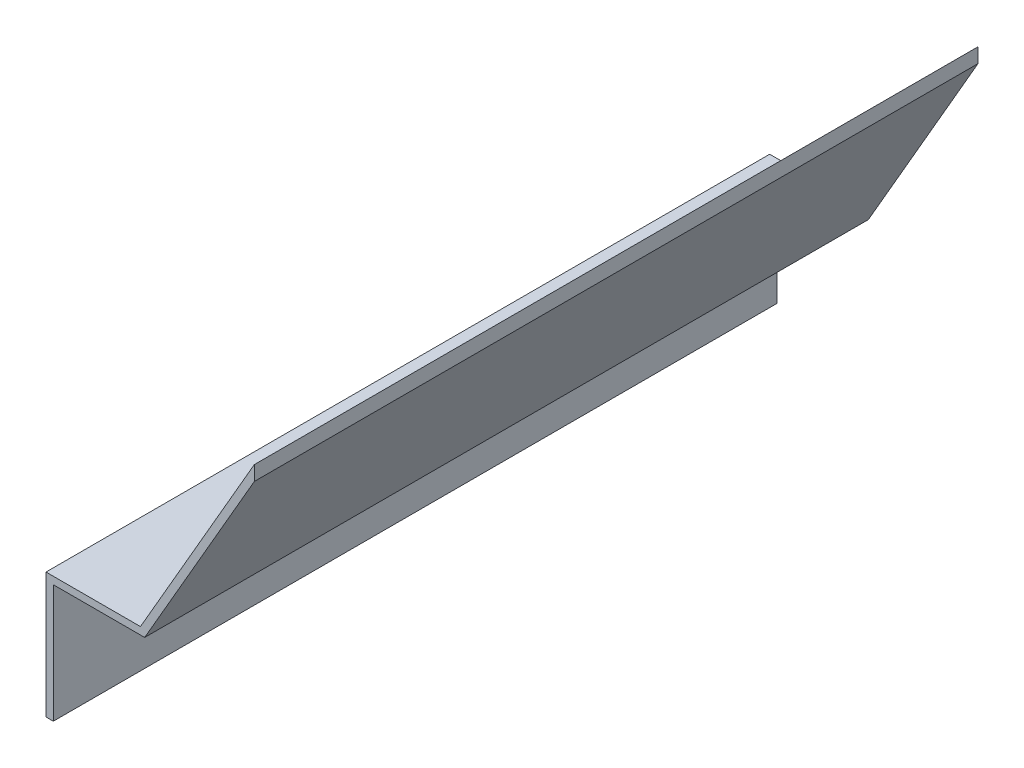
ISO-10303-21;
HEADER;
FILE_DESCRIPTION(('STEP AP214'),'2;1');
FILE_NAME('part.step','',(''),(''),'','','');
FILE_SCHEMA(('AUTOMOTIVE_DESIGN { 1 0 10303 214 1 1 1 1 }'));
ENDSEC;
DATA;
#1=APPLICATION_CONTEXT('core data for automotive mechanical design processes');
#2=APPLICATION_PROTOCOL_DEFINITION('international standard','automotive_design',2000,#1);
#3=PRODUCT_CONTEXT('',#1,'mechanical');
#4=PRODUCT('Part','Part','',(#3));
#5=PRODUCT_RELATED_PRODUCT_CATEGORY('part','',(#4));
#6=PRODUCT_DEFINITION_FORMATION('','',#4);
#7=PRODUCT_DEFINITION_CONTEXT('part definition',#1,'design');
#8=PRODUCT_DEFINITION('design','',#6,#7);
#9=PRODUCT_DEFINITION_SHAPE('','',#8);
#10=(LENGTH_UNIT() NAMED_UNIT(*) SI_UNIT(.MILLI.,.METRE.));
#11=(NAMED_UNIT(*) PLANE_ANGLE_UNIT() SI_UNIT($,.RADIAN.));
#12=(NAMED_UNIT(*) SI_UNIT($,.STERADIAN.) SOLID_ANGLE_UNIT());
#13=UNCERTAINTY_MEASURE_WITH_UNIT(LENGTH_MEASURE(1.E-05),#10,'distance_accuracy_value','');
#14=(GEOMETRIC_REPRESENTATION_CONTEXT(3) GLOBAL_UNCERTAINTY_ASSIGNED_CONTEXT((#13)) GLOBAL_UNIT_ASSIGNED_CONTEXT((#10,
#11,#12)) REPRESENTATION_CONTEXT('',''));
#15=CARTESIAN_POINT('',(0.,0.,0.));
#16=DIRECTION('',(0.,0.,1.));
#17=DIRECTION('',(1.,0.,0.));
#18=AXIS2_PLACEMENT_3D('',#15,#16,#17);
#19=CARTESIAN_POINT('',(-108.888143665837,84.1038517563225,198.));
#20=DIRECTION('',(0.,1.,0.));
#21=DIRECTION('',(0.,0.,1.));
#22=AXIS2_PLACEMENT_3D('',#19,#20,#21);
#23=PLANE('',#22);
#24=DIRECTION('',(1.,0.,0.));
#25=VECTOR('',#24,1.);
#26=CARTESIAN_POINT('',(-108.888143665837,84.1038517563225,0.));
#27=LINE('',#26,#25);
#28=CARTESIAN_POINT('',(-108.888143665837,84.1038517563225,0.));
#29=VERTEX_POINT('',#28);
#30=CARTESIAN_POINT('',(-106.888143665837,84.1038517563225,0.));
#31=VERTEX_POINT('',#30);
#32=EDGE_CURVE('E138',#29,#31,#27,.T.);
#33=ORIENTED_EDGE('',*,*,#32,.T.);
#34=DIRECTION('',(0.,0.,-1.));
#35=VECTOR('',#34,1.);
#36=CARTESIAN_POINT('',(-106.888143665837,84.1038517563225,198.));
#37=LINE('',#36,#35);
#38=CARTESIAN_POINT('',(-106.888143665837,84.1038517563225,198.));
#39=VERTEX_POINT('',#38);
#40=EDGE_CURVE('E11',#39,#31,#37,.T.);
#41=ORIENTED_EDGE('',*,*,#40,.F.);
#42=DIRECTION('',(1.,0.,0.));
#43=VECTOR('',#42,1.);
#44=CARTESIAN_POINT('',(-108.888143665837,84.1038517563225,198.));
#45=LINE('',#44,#43);
#46=CARTESIAN_POINT('',(-108.888143665837,84.1038517563225,198.));
#47=VERTEX_POINT('',#46);
#48=EDGE_CURVE('E153',#47,#39,#45,.T.);
#49=ORIENTED_EDGE('',*,*,#48,.F.);
#50=DIRECTION('',(0.,0.,-1.));
#51=VECTOR('',#50,1.);
#52=CARTESIAN_POINT('',(-108.888143665837,84.1038517563225,198.));
#53=LINE('',#52,#51);
#54=EDGE_CURVE('E134',#47,#29,#53,.T.);
#55=ORIENTED_EDGE('',*,*,#54,.T.);
#56=EDGE_LOOP('',(#33,#41,#49,#55));
#57=FACE_BOUND('',#56,.T.);
#58=ADVANCED_FACE('F43',(#57),#23,.F.);
#59=CARTESIAN_POINT('',(-106.888143665837,84.1038517563225,198.));
#60=DIRECTION('',(-1.,0.,0.));
#61=DIRECTION('',(0.,-1.,0.));
#62=AXIS2_PLACEMENT_3D('',#59,#60,#61);
#63=PLANE('',#62);
#64=DIRECTION('',(0.,1.,0.));
#65=VECTOR('',#64,1.);
#66=CARTESIAN_POINT('',(-106.888143665837,84.1038517563225,0.));
#67=LINE('',#66,#65);
#68=CARTESIAN_POINT('',(-106.888143665837,116.45919081565,0.));
#69=VERTEX_POINT('',#68);
#70=EDGE_CURVE('E141',#31,#69,#67,.T.);
#71=ORIENTED_EDGE('',*,*,#70,.T.);
#72=DIRECTION('',(0.,0.,-1.));
#73=VECTOR('',#72,1.);
#74=CARTESIAN_POINT('',(-106.888143665837,116.45919081565,198.));
#75=LINE('',#74,#73);
#76=CARTESIAN_POINT('',(-106.888143665837,116.45919081565,198.));
#77=VERTEX_POINT('',#76);
#78=EDGE_CURVE('E51',#77,#69,#75,.T.);
#79=ORIENTED_EDGE('',*,*,#78,.F.);
#80=DIRECTION('',(0.,1.,0.));
#81=VECTOR('',#80,1.);
#82=CARTESIAN_POINT('',(-106.888143665837,84.1038517563225,198.));
#83=LINE('',#82,#81);
#84=EDGE_CURVE('E102',#39,#77,#83,.T.);
#85=ORIENTED_EDGE('',*,*,#84,.F.);
#86=ORIENTED_EDGE('',*,*,#40,.T.);
#87=EDGE_LOOP('',(#71,#79,#85,#86));
#88=FACE_BOUND('',#87,.T.);
#89=ADVANCED_FACE('F188',(#88),#63,.F.);
#90=CARTESIAN_POINT('',(-106.888143665837,116.45919081565,198.));
#91=DIRECTION('',(0.,1.,0.));
#92=DIRECTION('',(0.,0.,1.));
#93=AXIS2_PLACEMENT_3D('',#90,#91,#92);
#94=PLANE('',#93);
#95=DIRECTION('',(1.,0.,0.));
#96=VECTOR('',#95,1.);
#97=CARTESIAN_POINT('',(-106.888143665837,116.45919081565,0.));
#98=LINE('',#97,#96);
#99=CARTESIAN_POINT('',(-81.8881436658367,116.45919081565,0.));
#100=VERTEX_POINT('',#99);
#101=EDGE_CURVE('E143',#69,#100,#98,.T.);
#102=ORIENTED_EDGE('',*,*,#101,.T.);
#103=DIRECTION('',(0.,0.,-1.));
#104=VECTOR('',#103,1.);
#105=CARTESIAN_POINT('',(-81.8881436658367,116.45919081565,198.));
#106=LINE('',#105,#104);
#107=CARTESIAN_POINT('',(-81.8881436658367,116.45919081565,198.));
#108=VERTEX_POINT('',#107);
#109=EDGE_CURVE('E160',#108,#100,#106,.T.);
#110=ORIENTED_EDGE('',*,*,#109,.F.);
#111=DIRECTION('',(1.,0.,0.));
#112=VECTOR('',#111,1.);
#113=CARTESIAN_POINT('',(-106.888143665837,116.45919081565,198.));
#114=LINE('',#113,#112);
#115=EDGE_CURVE('E168',#77,#108,#114,.T.);
#116=ORIENTED_EDGE('',*,*,#115,.F.);
#117=ORIENTED_EDGE('',*,*,#78,.T.);
#118=EDGE_LOOP('',(#102,#110,#116,#117));
#119=FACE_BOUND('',#118,.T.);
#120=ADVANCED_FACE('F166',(#119),#94,.F.);
#121=CARTESIAN_POINT('',(-81.8881436658367,116.45919081565,198.));
#122=DIRECTION('',(-0.866025403784438,0.5,0.));
#123=DIRECTION('',(-0.5,-0.866025403784439,0.));
#124=AXIS2_PLACEMENT_3D('',#121,#122,#123);
#125=PLANE('',#124);
#126=DIRECTION('',(0.5,0.866025403784438,0.));
#127=VECTOR('',#126,1.);
#128=CARTESIAN_POINT('',(-81.8881436658367,116.45919081565,0.));
#129=LINE('',#128,#127);
#130=CARTESIAN_POINT('',(-51.8881436658367,168.420715042716,0.));
#131=VERTEX_POINT('',#130);
#132=EDGE_CURVE('E145',#100,#131,#129,.T.);
#133=ORIENTED_EDGE('',*,*,#132,.T.);
#134=DIRECTION('',(0.,0.,-1.));
#135=VECTOR('',#134,1.);
#136=CARTESIAN_POINT('',(-51.8881436658367,168.420715042716,198.));
#137=LINE('',#136,#135);
#138=CARTESIAN_POINT('',(-51.8881436658367,168.420715042716,198.));
#139=VERTEX_POINT('',#138);
#140=EDGE_CURVE('E157',#139,#131,#137,.T.);
#141=ORIENTED_EDGE('',*,*,#140,.F.);
#142=DIRECTION('',(0.5,0.866025403784438,0.));
#143=VECTOR('',#142,1.);
#144=CARTESIAN_POINT('',(-81.8881436658367,116.45919081565,198.));
#145=LINE('',#144,#143);
#146=EDGE_CURVE('E180',#108,#139,#145,.T.);
#147=ORIENTED_EDGE('',*,*,#146,.F.);
#148=ORIENTED_EDGE('',*,*,#109,.T.);
#149=EDGE_LOOP('',(#133,#141,#147,#148));
#150=FACE_BOUND('',#149,.T.);
#151=ADVANCED_FACE('F176',(#150),#125,.F.);
#152=CARTESIAN_POINT('',(-51.8881436658367,172.420715042716,198.));
#153=DIRECTION('',(-1.,0.,0.));
#154=DIRECTION('',(0.,0.,1.));
#155=AXIS2_PLACEMENT_3D('',#152,#153,#154);
#156=PLANE('',#155);
#157=DIRECTION('',(0.,1.,0.));
#158=VECTOR('',#157,1.);
#159=CARTESIAN_POINT('',(-51.8881436658367,172.420715042716,0.));
#160=LINE('',#159,#158);
#161=CARTESIAN_POINT('',(-51.8881436658367,172.420715042716,0.));
#162=VERTEX_POINT('',#161);
#163=EDGE_CURVE('E147',#131,#162,#160,.T.);
#164=ORIENTED_EDGE('',*,*,#163,.T.);
#165=DIRECTION('',(0.,0.,-1.));
#166=VECTOR('',#165,1.);
#167=CARTESIAN_POINT('',(-51.8881436658367,172.420715042716,198.));
#168=LINE('',#167,#166);
#169=CARTESIAN_POINT('',(-51.8881436658367,172.420715042716,198.));
#170=VERTEX_POINT('',#169);
#171=EDGE_CURVE('E129',#170,#162,#168,.T.);
#172=ORIENTED_EDGE('',*,*,#171,.F.);
#173=DIRECTION('',(0.,1.,0.));
#174=VECTOR('',#173,1.);
#175=CARTESIAN_POINT('',(-51.8881436658367,172.420715042716,198.));
#176=LINE('',#175,#174);
#177=EDGE_CURVE('E121',#139,#170,#176,.T.);
#178=ORIENTED_EDGE('',*,*,#177,.F.);
#179=ORIENTED_EDGE('',*,*,#140,.T.);
#180=EDGE_LOOP('',(#164,#172,#178,#179));
#181=FACE_BOUND('',#180,.T.);
#182=ADVANCED_FACE('F179',(#181),#156,.F.);
#183=CARTESIAN_POINT('',(-83.042844204216,118.45919081565,198.));
#184=DIRECTION('',(0.866025403784439,-0.5,0.));
#185=DIRECTION('',(0.5,0.866025403784439,0.));
#186=AXIS2_PLACEMENT_3D('',#183,#184,#185);
#187=PLANE('',#186);
#188=DIRECTION('',(-0.5,-0.866025403784439,0.));
#189=VECTOR('',#188,1.);
#190=CARTESIAN_POINT('',(-83.042844204216,118.45919081565,0.));
#191=LINE('',#190,#189);
#192=CARTESIAN_POINT('',(-83.042844204216,118.45919081565,0.));
#193=VERTEX_POINT('',#192);
#194=EDGE_CURVE('E128',#162,#193,#191,.T.);
#195=ORIENTED_EDGE('',*,*,#194,.T.);
#196=DIRECTION('',(0.,0.,-1.));
#197=VECTOR('',#196,1.);
#198=CARTESIAN_POINT('',(-83.042844204216,118.45919081565,198.));
#199=LINE('',#198,#197);
#200=CARTESIAN_POINT('',(-83.042844204216,118.45919081565,198.));
#201=VERTEX_POINT('',#200);
#202=EDGE_CURVE('E126',#201,#193,#199,.T.);
#203=ORIENTED_EDGE('',*,*,#202,.F.);
#204=DIRECTION('',(-0.500000000000001,-0.866025403784438,0.));
#205=VECTOR('',#204,1.);
#206=CARTESIAN_POINT('',(-53.6201944734056,169.420715042716,198.));
#207=LINE('',#206,#205);
#208=EDGE_CURVE('E115',#170,#201,#207,.T.);
#209=ORIENTED_EDGE('',*,*,#208,.F.);
#210=ORIENTED_EDGE('',*,*,#171,.T.);
#211=EDGE_LOOP('',(#195,#203,#209,#210));
#212=FACE_BOUND('',#211,.T.);
#213=ADVANCED_FACE('F127',(#212),#187,.F.);
#214=CARTESIAN_POINT('',(-108.888143665837,118.45919081565,198.));
#215=DIRECTION('',(0.,-1.,0.));
#216=DIRECTION('',(0.,0.,-1.));
#217=AXIS2_PLACEMENT_3D('',#214,#215,#216);
#218=PLANE('',#217);
#219=DIRECTION('',(-1.,0.,0.));
#220=VECTOR('',#219,1.);
#221=CARTESIAN_POINT('',(-108.888143665837,118.45919081565,0.));
#222=LINE('',#221,#220);
#223=CARTESIAN_POINT('',(-108.888143665837,118.45919081565,0.));
#224=VERTEX_POINT('',#223);
#225=EDGE_CURVE('E88',#193,#224,#222,.T.);
#226=ORIENTED_EDGE('',*,*,#225,.T.);
#227=DIRECTION('',(0.,0.,-1.));
#228=VECTOR('',#227,1.);
#229=CARTESIAN_POINT('',(-108.888143665837,118.45919081565,198.));
#230=LINE('',#229,#228);
#231=CARTESIAN_POINT('',(-108.888143665837,118.45919081565,198.));
#232=VERTEX_POINT('',#231);
#233=EDGE_CURVE('E130',#232,#224,#230,.T.);
#234=ORIENTED_EDGE('',*,*,#233,.F.);
#235=DIRECTION('',(-1.,0.,0.));
#236=VECTOR('',#235,1.);
#237=CARTESIAN_POINT('',(-108.888143665837,118.45919081565,198.));
#238=LINE('',#237,#236);
#239=EDGE_CURVE('E119',#201,#232,#238,.T.);
#240=ORIENTED_EDGE('',*,*,#239,.F.);
#241=ORIENTED_EDGE('',*,*,#202,.T.);
#242=EDGE_LOOP('',(#226,#234,#240,#241));
#243=FACE_BOUND('',#242,.T.);
#244=ADVANCED_FACE('F132',(#243),#218,.F.);
#245=CARTESIAN_POINT('',(-108.888143665837,84.1038517563225,198.));
#246=DIRECTION('',(1.,0.,0.));
#247=DIRECTION('',(0.,0.,-1.));
#248=AXIS2_PLACEMENT_3D('',#245,#246,#247);
#249=PLANE('',#248);
#250=DIRECTION('',(0.,-1.,0.));
#251=VECTOR('',#250,1.);
#252=CARTESIAN_POINT('',(-108.888143665837,84.1038517563225,0.));
#253=LINE('',#252,#251);
#254=EDGE_CURVE('E94',#224,#29,#253,.T.);
#255=ORIENTED_EDGE('',*,*,#254,.T.);
#256=ORIENTED_EDGE('',*,*,#54,.F.);
#257=DIRECTION('',(0.,-1.,0.));
#258=VECTOR('',#257,1.);
#259=CARTESIAN_POINT('',(-108.888143665837,84.1038517563225,198.));
#260=LINE('',#259,#258);
#261=EDGE_CURVE('E59',#232,#47,#260,.T.);
#262=ORIENTED_EDGE('',*,*,#261,.F.);
#263=ORIENTED_EDGE('',*,*,#233,.T.);
#264=EDGE_LOOP('',(#255,#256,#262,#263));
#265=FACE_BOUND('',#264,.T.);
#266=ADVANCED_FACE('F204',(#265),#249,.F.);
#267=CARTESIAN_POINT('',(0.,0.,198.));
#268=DIRECTION('',(0.,0.,1.));
#269=DIRECTION('',(1.,0.,0.));
#270=AXIS2_PLACEMENT_3D('',#267,#268,#269);
#271=PLANE('',#270);
#272=ORIENTED_EDGE('',*,*,#48,.T.);
#273=ORIENTED_EDGE('',*,*,#84,.T.);
#274=ORIENTED_EDGE('',*,*,#115,.T.);
#275=ORIENTED_EDGE('',*,*,#146,.T.);
#276=ORIENTED_EDGE('',*,*,#177,.T.);
#277=ORIENTED_EDGE('',*,*,#208,.T.);
#278=ORIENTED_EDGE('',*,*,#239,.T.);
#279=ORIENTED_EDGE('',*,*,#261,.T.);
#280=EDGE_LOOP('',(#272,#273,#274,#275,#276,#277,#278,#279));
#281=FACE_BOUND('',#280,.T.);
#282=ADVANCED_FACE('F117',(#281),#271,.T.);
#283=CARTESIAN_POINT('',(0.,0.,0.));
#284=DIRECTION('',(0.,0.,1.));
#285=DIRECTION('',(1.,0.,0.));
#286=AXIS2_PLACEMENT_3D('',#283,#284,#285);
#287=PLANE('',#286);
#288=ORIENTED_EDGE('',*,*,#32,.F.);
#289=ORIENTED_EDGE('',*,*,#254,.F.);
#290=ORIENTED_EDGE('',*,*,#225,.F.);
#291=ORIENTED_EDGE('',*,*,#194,.F.);
#292=ORIENTED_EDGE('',*,*,#163,.F.);
#293=ORIENTED_EDGE('',*,*,#132,.F.);
#294=ORIENTED_EDGE('',*,*,#101,.F.);
#295=ORIENTED_EDGE('',*,*,#70,.F.);
#296=EDGE_LOOP('',(#288,#289,#290,#291,#292,#293,#294,#295));
#297=FACE_BOUND('',#296,.T.);
#298=ADVANCED_FACE('F172',(#297),#287,.F.);
#299=CLOSED_SHELL('',(#58,#89,#120,#151,#182,#213,#244,#266,#282,#298));
#300=MANIFOLD_SOLID_BREP('B2',#299);
#301=ADVANCED_BREP_SHAPE_REPRESENTATION('',(#18,#300),#14);
#302=SHAPE_DEFINITION_REPRESENTATION(#9,#301);
ENDSEC;
END-ISO-10303-21;
